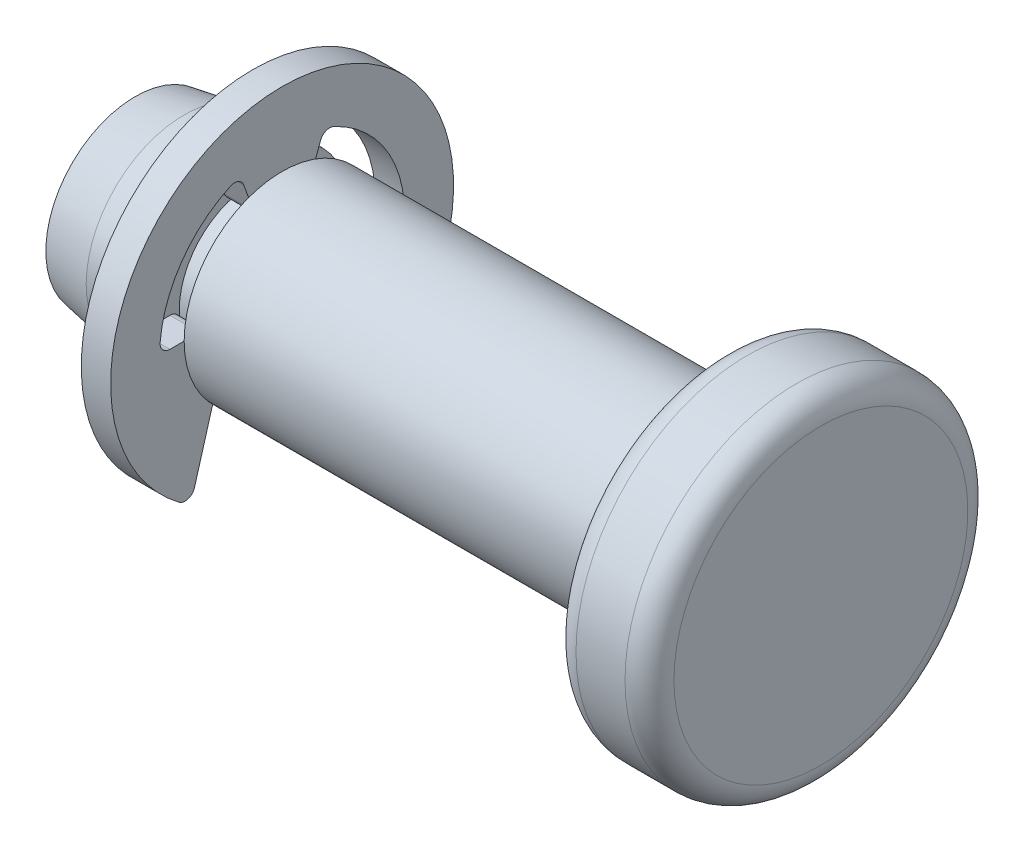
ISO-10303-21;
HEADER;
FILE_DESCRIPTION(('STEP AP214'),'2;1');
FILE_NAME('part.step','',(''),(''),'','','');
FILE_SCHEMA(('AUTOMOTIVE_DESIGN { 1 0 10303 214 1 1 1 1 }'));
ENDSEC;
DATA;
#1=APPLICATION_CONTEXT('core data for automotive mechanical design processes');
#2=APPLICATION_PROTOCOL_DEFINITION('international standard','automotive_design',2000,#1);
#3=PRODUCT_CONTEXT('',#1,'mechanical');
#4=PRODUCT('Part','Part','',(#3));
#5=PRODUCT_RELATED_PRODUCT_CATEGORY('part','',(#4));
#6=PRODUCT_DEFINITION_FORMATION('','',#4);
#7=PRODUCT_DEFINITION_CONTEXT('part definition',#1,'design');
#8=PRODUCT_DEFINITION('design','',#6,#7);
#9=PRODUCT_DEFINITION_SHAPE('','',#8);
#10=(LENGTH_UNIT() NAMED_UNIT(*) SI_UNIT(.MILLI.,.METRE.));
#11=(NAMED_UNIT(*) PLANE_ANGLE_UNIT() SI_UNIT($,.RADIAN.));
#12=(NAMED_UNIT(*) SI_UNIT($,.STERADIAN.) SOLID_ANGLE_UNIT());
#13=UNCERTAINTY_MEASURE_WITH_UNIT(LENGTH_MEASURE(1.E-05),#10,'distance_accuracy_value','');
#14=(GEOMETRIC_REPRESENTATION_CONTEXT(3) GLOBAL_UNCERTAINTY_ASSIGNED_CONTEXT((#13)) GLOBAL_UNIT_ASSIGNED_CONTEXT((#10,
#11,#12)) REPRESENTATION_CONTEXT('',''));
#15=CARTESIAN_POINT('',(0.,0.,0.));
#16=DIRECTION('',(0.,0.,1.));
#17=DIRECTION('',(1.,0.,0.));
#18=AXIS2_PLACEMENT_3D('',#15,#16,#17);
#19=CARTESIAN_POINT('',(-11.6,0.,0.));
#20=DIRECTION('',(1.,0.,0.));
#21=DIRECTION('',(0.,0.,-1.));
#22=AXIS2_PLACEMENT_3D('',#19,#20,#21);
#23=CYLINDRICAL_SURFACE('',#22,1.5);
#24=CARTESIAN_POINT('',(-11.6,0.,0.));
#25=DIRECTION('',(1.,0.,0.));
#26=DIRECTION('',(0.,0.,1.));
#27=AXIS2_PLACEMENT_3D('',#24,#25,#26);
#28=CIRCLE('',#27,1.5);
#29=CARTESIAN_POINT('',(-11.6,-0.758166141891704,-1.29428903313327));
#30=VERTEX_POINT('',#29);
#31=CARTESIAN_POINT('',(-11.6,-0.176470588235294,-1.48958320730595));
#32=VERTEX_POINT('',#31);
#33=EDGE_CURVE('E227',#30,#32,#28,.T.);
#34=ORIENTED_EDGE('',*,*,#33,.F.);
#35=DIRECTION('',(1.,0.,0.));
#36=VECTOR('',#35,1.);
#37=CARTESIAN_POINT('',(-11.6,-0.758166141891704,-1.29428903313327));
#38=LINE('',#37,#36);
#39=CARTESIAN_POINT('',(-11.,-0.758166141891704,-1.29428903313327));
#40=VERTEX_POINT('',#39);
#41=EDGE_CURVE('E212',#30,#40,#38,.T.);
#42=ORIENTED_EDGE('',*,*,#41,.T.);
#43=CARTESIAN_POINT('',(-11.,0.,0.));
#44=DIRECTION('',(1.,0.,0.));
#45=DIRECTION('',(0.,0.,1.));
#46=AXIS2_PLACEMENT_3D('',#43,#44,#45);
#47=CIRCLE('',#46,1.5);
#48=CARTESIAN_POINT('',(-11.,-0.176470588235294,-1.48958320730595));
#49=VERTEX_POINT('',#48);
#50=EDGE_CURVE('E224',#40,#49,#47,.T.);
#51=ORIENTED_EDGE('',*,*,#50,.T.);
#52=DIRECTION('',(1.,0.,0.));
#53=VECTOR('',#52,1.);
#54=CARTESIAN_POINT('',(-11.6,-0.176470588235294,-1.48958320730595));
#55=LINE('',#54,#53);
#56=EDGE_CURVE('E229',#49,#32,#55,.F.);
#57=ORIENTED_EDGE('',*,*,#56,.T.);
#58=EDGE_LOOP('',(#34,#42,#51,#57));
#59=FACE_BOUND('',#58,.T.);
#60=ADVANCED_FACE('F46',(#59),#23,.F.);
#61=CARTESIAN_POINT('',(-11.6,0.,-1.5));
#62=DIRECTION('',(0.,-1.,0.));
#63=DIRECTION('',(0.,0.,-1.));
#64=AXIS2_PLACEMENT_3D('',#61,#62,#63);
#65=PLANE('',#64);
#66=DIRECTION('',(0.,0.,-1.));
#67=VECTOR('',#66,1.);
#68=CARTESIAN_POINT('',(-11.,0.,-1.5));
#69=LINE('',#68,#67);
#70=CARTESIAN_POINT('',(-11.,0.,-1.68819430161341));
#71=VERTEX_POINT('',#70);
#72=CARTESIAN_POINT('',(-11.,0.,-2.29128784747792));
#73=VERTEX_POINT('',#72);
#74=EDGE_CURVE('E234',#71,#73,#69,.T.);
#75=ORIENTED_EDGE('',*,*,#74,.T.);
#76=DIRECTION('',(-1.,0.,0.));
#77=VECTOR('',#76,1.);
#78=CARTESIAN_POINT('',(-11.6,0.,-2.29128784747792));
#79=LINE('',#78,#77);
#80=CARTESIAN_POINT('',(-11.6,0.,-2.29128784747792));
#81=VERTEX_POINT('',#80);
#82=EDGE_CURVE('E347',#73,#81,#79,.T.);
#83=ORIENTED_EDGE('',*,*,#82,.T.);
#84=DIRECTION('',(0.,0.,-1.));
#85=VECTOR('',#84,1.);
#86=CARTESIAN_POINT('',(-11.6,0.,-1.5));
#87=LINE('',#86,#85);
#88=CARTESIAN_POINT('',(-11.6,0.,-1.68819430161341));
#89=VERTEX_POINT('',#88);
#90=EDGE_CURVE('E377',#89,#81,#87,.T.);
#91=ORIENTED_EDGE('',*,*,#90,.F.);
#92=DIRECTION('',(1.,0.,0.));
#93=VECTOR('',#92,1.);
#94=CARTESIAN_POINT('',(-11.6,0.,-1.68819430161341));
#95=LINE('',#94,#93);
#96=EDGE_CURVE('E344',#89,#71,#95,.T.);
#97=ORIENTED_EDGE('',*,*,#96,.T.);
#98=EDGE_LOOP('',(#75,#83,#91,#97));
#99=FACE_BOUND('',#98,.T.);
#100=ADVANCED_FACE('F365',(#99),#65,.F.);
#101=CARTESIAN_POINT('',(-11.6,0.,0.));
#102=DIRECTION('',(1.,0.,0.));
#103=DIRECTION('',(0.,0.,-1.));
#104=AXIS2_PLACEMENT_3D('',#101,#102,#103);
#105=CYLINDRICAL_SURFACE('',#104,2.5);
#106=CARTESIAN_POINT('',(-11.,0.,0.));
#107=DIRECTION('',(1.,0.,0.));
#108=DIRECTION('',(0.,0.,-1.));
#109=AXIS2_PLACEMENT_3D('',#106,#107,#108);
#110=CIRCLE('',#109,2.5);
#111=CARTESIAN_POINT('',(-11.,0.217391304347826,-2.49053026899774));
#112=VERTEX_POINT('',#111);
#113=CARTESIAN_POINT('',(-11.,2.26598071055033,-1.05609252407819));
#114=VERTEX_POINT('',#113);
#115=EDGE_CURVE('E237',#112,#114,#110,.T.);
#116=ORIENTED_EDGE('',*,*,#115,.T.);
#117=DIRECTION('',(1.,0.,0.));
#118=VECTOR('',#117,1.);
#119=CARTESIAN_POINT('',(-11.6,2.26598071055033,-1.05609252407819));
#120=LINE('',#119,#118);
#121=CARTESIAN_POINT('',(-11.6,2.26598071055033,-1.05609252407819));
#122=VERTEX_POINT('',#121);
#123=EDGE_CURVE('E342',#114,#122,#120,.F.);
#124=ORIENTED_EDGE('',*,*,#123,.T.);
#125=CARTESIAN_POINT('',(-11.6,0.,0.));
#126=DIRECTION('',(1.,0.,0.));
#127=DIRECTION('',(0.,0.,-1.));
#128=AXIS2_PLACEMENT_3D('',#125,#126,#127);
#129=CIRCLE('',#128,2.5);
#130=CARTESIAN_POINT('',(-11.6,0.217391304347826,-2.49053026899774));
#131=VERTEX_POINT('',#130);
#132=EDGE_CURVE('E375',#131,#122,#129,.T.);
#133=ORIENTED_EDGE('',*,*,#132,.F.);
#134=DIRECTION('',(1.,0.,0.));
#135=VECTOR('',#134,1.);
#136=CARTESIAN_POINT('',(-11.6,0.217391304347826,-2.49053026899774));
#137=LINE('',#136,#135);
#138=EDGE_CURVE('E339',#131,#112,#137,.T.);
#139=ORIENTED_EDGE('',*,*,#138,.T.);
#140=EDGE_LOOP('',(#116,#124,#133,#139));
#141=FACE_BOUND('',#140,.T.);
#142=ADVANCED_FACE('F379',(#141),#105,.F.);
#143=CARTESIAN_POINT('',(-11.6,1.40953893117887,-0.513030214988495));
#144=DIRECTION('',(0.,0.342020143325663,0.93969262078591));
#145=DIRECTION('',(0.,-0.939692620785911,0.342020143325663));
#146=AXIS2_PLACEMENT_3D('',#143,#144,#145);
#147=PLANE('',#146);
#148=DIRECTION('',(0.,-0.93969262078591,0.342020143325663));
#149=VECTOR('',#148,1.);
#150=CARTESIAN_POINT('',(-11.,1.40953893117887,-0.513030214988495));
#151=LINE('',#150,#149);
#152=CARTESIAN_POINT('',(-11.,2.15310628237143,-0.783666597994748));
#153=VERTEX_POINT('',#152);
#154=CARTESIAN_POINT('',(-11.,1.58638372767895,-0.577396456999388));
#155=VERTEX_POINT('',#154);
#156=EDGE_CURVE('E245',#153,#155,#151,.T.);
#157=ORIENTED_EDGE('',*,*,#156,.T.);
#158=DIRECTION('',(1.,0.,0.));
#159=VECTOR('',#158,1.);
#160=CARTESIAN_POINT('',(-11.6,1.58638372767895,-0.577396456999388));
#161=LINE('',#160,#159);
#162=CARTESIAN_POINT('',(-11.6,1.58638372767895,-0.577396456999388));
#163=VERTEX_POINT('',#162);
#164=EDGE_CURVE('E337',#155,#163,#161,.F.);
#165=ORIENTED_EDGE('',*,*,#164,.T.);
#166=DIRECTION('',(0.,-0.93969262078591,0.342020143325663));
#167=VECTOR('',#166,1.);
#168=CARTESIAN_POINT('',(-11.6,1.40953893117887,-0.513030214988495));
#169=LINE('',#168,#167);
#170=CARTESIAN_POINT('',(-11.6,2.15310628237143,-0.783666597994748));
#171=VERTEX_POINT('',#170);
#172=EDGE_CURVE('E381',#171,#163,#169,.T.);
#173=ORIENTED_EDGE('',*,*,#172,.F.);
#174=DIRECTION('',(-1.,0.,0.));
#175=VECTOR('',#174,1.);
#176=CARTESIAN_POINT('',(-11.,2.15310628237143,-0.783666597994749));
#177=LINE('',#176,#175);
#178=EDGE_CURVE('E334',#171,#153,#177,.F.);
#179=ORIENTED_EDGE('',*,*,#178,.T.);
#180=EDGE_LOOP('',(#157,#165,#173,#179));
#181=FACE_BOUND('',#180,.T.);
#182=ADVANCED_FACE('F473',(#181),#147,.F.);
#183=CARTESIAN_POINT('',(-11.6,0.,0.));
#184=DIRECTION('',(1.,0.,0.));
#185=DIRECTION('',(0.,0.,-1.));
#186=AXIS2_PLACEMENT_3D('',#183,#184,#185);
#187=CYLINDRICAL_SURFACE('',#186,1.5);
#188=CARTESIAN_POINT('',(-11.,0.,0.));
#189=DIRECTION('',(1.,0.,0.));
#190=DIRECTION('',(0.,0.,1.));
#191=AXIS2_PLACEMENT_3D('',#188,#189,#190);
#192=CIRCLE('',#191,1.5);
#193=CARTESIAN_POINT('',(-11.,1.46010684383301,-0.343639352507828));
#194=VERTEX_POINT('',#193);
#195=CARTESIAN_POINT('',(-11.,1.46010684383301,0.343639352507828));
#196=VERTEX_POINT('',#195);
#197=EDGE_CURVE('E248',#194,#196,#192,.T.);
#198=ORIENTED_EDGE('',*,*,#197,.T.);
#199=DIRECTION('',(1.,0.,0.));
#200=VECTOR('',#199,1.);
#201=CARTESIAN_POINT('',(-11.6,1.46010684383301,0.343639352507829));
#202=LINE('',#201,#200);
#203=CARTESIAN_POINT('',(-11.6,1.46010684383301,0.343639352507828));
#204=VERTEX_POINT('',#203);
#205=EDGE_CURVE('E332',#196,#204,#202,.F.);
#206=ORIENTED_EDGE('',*,*,#205,.T.);
#207=CARTESIAN_POINT('',(-11.6,0.,0.));
#208=DIRECTION('',(1.,0.,0.));
#209=DIRECTION('',(0.,0.,1.));
#210=AXIS2_PLACEMENT_3D('',#207,#208,#209);
#211=CIRCLE('',#210,1.5);
#212=CARTESIAN_POINT('',(-11.6,1.46010684383301,-0.343639352507828));
#213=VERTEX_POINT('',#212);
#214=EDGE_CURVE('E384',#213,#204,#211,.T.);
#215=ORIENTED_EDGE('',*,*,#214,.F.);
#216=DIRECTION('',(1.,0.,0.));
#217=VECTOR('',#216,1.);
#218=CARTESIAN_POINT('',(-11.6,1.46010684383301,-0.343639352507828));
#219=LINE('',#218,#217);
#220=EDGE_CURVE('E329',#213,#194,#219,.T.);
#221=ORIENTED_EDGE('',*,*,#220,.T.);
#222=EDGE_LOOP('',(#198,#206,#215,#221));
#223=FACE_BOUND('',#222,.T.);
#224=ADVANCED_FACE('F464',(#223),#187,.F.);
#225=CARTESIAN_POINT('',(-11.6,1.40953893117887,0.513030214988495));
#226=DIRECTION('',(0.,0.342020143325663,-0.93969262078591));
#227=DIRECTION('',(0.,0.939692620785911,0.342020143325663));
#228=AXIS2_PLACEMENT_3D('',#225,#226,#227);
#229=PLANE('',#228);
#230=DIRECTION('',(0.,0.939692620785911,0.342020143325663));
#231=VECTOR('',#230,1.);
#232=CARTESIAN_POINT('',(-11.,1.40953893117887,0.513030214988495));
#233=LINE('',#232,#231);
#234=CARTESIAN_POINT('',(-11.,1.58638372767895,0.577396456999388));
#235=VERTEX_POINT('',#234);
#236=CARTESIAN_POINT('',(-11.,2.15310628237143,0.783666597994749));
#237=VERTEX_POINT('',#236);
#238=EDGE_CURVE('E251',#235,#237,#233,.T.);
#239=ORIENTED_EDGE('',*,*,#238,.T.);
#240=DIRECTION('',(-1.,0.,0.));
#241=VECTOR('',#240,1.);
#242=CARTESIAN_POINT('',(-11.6,2.15310628237143,0.783666597994749));
#243=LINE('',#242,#241);
#244=CARTESIAN_POINT('',(-11.6,2.15310628237143,0.783666597994749));
#245=VERTEX_POINT('',#244);
#246=EDGE_CURVE('E327',#237,#245,#243,.T.);
#247=ORIENTED_EDGE('',*,*,#246,.T.);
#248=DIRECTION('',(0.,0.939692620785911,0.342020143325663));
#249=VECTOR('',#248,1.);
#250=CARTESIAN_POINT('',(-11.6,1.40953893117887,0.513030214988495));
#251=LINE('',#250,#249);
#252=CARTESIAN_POINT('',(-11.6,1.58638372767895,0.577396456999388));
#253=VERTEX_POINT('',#252);
#254=EDGE_CURVE('E391',#253,#245,#251,.T.);
#255=ORIENTED_EDGE('',*,*,#254,.F.);
#256=DIRECTION('',(1.,0.,0.));
#257=VECTOR('',#256,1.);
#258=CARTESIAN_POINT('',(-11.6,1.58638372767895,0.577396456999388));
#259=LINE('',#258,#257);
#260=EDGE_CURVE('E324',#253,#235,#259,.T.);
#261=ORIENTED_EDGE('',*,*,#260,.T.);
#262=EDGE_LOOP('',(#239,#247,#255,#261));
#263=FACE_BOUND('',#262,.T.);
#264=ADVANCED_FACE('F455',(#263),#229,.F.);
#265=CARTESIAN_POINT('',(-11.6,0.,0.));
#266=DIRECTION('',(1.,0.,0.));
#267=DIRECTION('',(0.,0.,-1.));
#268=AXIS2_PLACEMENT_3D('',#265,#266,#267);
#269=CYLINDRICAL_SURFACE('',#268,2.5);
#270=CARTESIAN_POINT('',(-11.,0.,0.));
#271=DIRECTION('',(1.,0.,0.));
#272=DIRECTION('',(0.,0.,1.));
#273=AXIS2_PLACEMENT_3D('',#270,#271,#272);
#274=CIRCLE('',#273,2.5);
#275=CARTESIAN_POINT('',(-11.,2.26598071055033,1.05609252407819));
#276=VERTEX_POINT('',#275);
#277=CARTESIAN_POINT('',(-11.,0.217391304347827,2.49053026899774));
#278=VERTEX_POINT('',#277);
#279=EDGE_CURVE('E254',#276,#278,#274,.T.);
#280=ORIENTED_EDGE('',*,*,#279,.T.);
#281=DIRECTION('',(1.,0.,0.));
#282=VECTOR('',#281,1.);
#283=CARTESIAN_POINT('',(-11.6,0.217391304347827,2.49053026899774));
#284=LINE('',#283,#282);
#285=CARTESIAN_POINT('',(-11.6,0.217391304347827,2.49053026899774));
#286=VERTEX_POINT('',#285);
#287=EDGE_CURVE('E322',#278,#286,#284,.F.);
#288=ORIENTED_EDGE('',*,*,#287,.T.);
#289=CARTESIAN_POINT('',(-11.6,0.,0.));
#290=DIRECTION('',(1.,0.,0.));
#291=DIRECTION('',(0.,0.,1.));
#292=AXIS2_PLACEMENT_3D('',#289,#290,#291);
#293=CIRCLE('',#292,2.5);
#294=CARTESIAN_POINT('',(-11.6,2.26598071055033,1.05609252407819));
#295=VERTEX_POINT('',#294);
#296=EDGE_CURVE('E394',#295,#286,#293,.T.);
#297=ORIENTED_EDGE('',*,*,#296,.F.);
#298=DIRECTION('',(1.,0.,0.));
#299=VECTOR('',#298,1.);
#300=CARTESIAN_POINT('',(-11.6,2.26598071055033,1.05609252407819));
#301=LINE('',#300,#299);
#302=EDGE_CURVE('E319',#295,#276,#301,.T.);
#303=ORIENTED_EDGE('',*,*,#302,.T.);
#304=EDGE_LOOP('',(#280,#288,#297,#303));
#305=FACE_BOUND('',#304,.T.);
#306=ADVANCED_FACE('F446',(#305),#269,.F.);
#307=CARTESIAN_POINT('',(-11.6,0.,1.5));
#308=DIRECTION('',(0.,-1.,0.));
#309=DIRECTION('',(0.,0.,-1.));
#310=AXIS2_PLACEMENT_3D('',#307,#308,#309);
#311=PLANE('',#310);
#312=DIRECTION('',(0.,0.,-1.));
#313=VECTOR('',#312,1.);
#314=CARTESIAN_POINT('',(-11.,0.,1.5));
#315=LINE('',#314,#313);
#316=CARTESIAN_POINT('',(-11.,0.,2.29128784747792));
#317=VERTEX_POINT('',#316);
#318=CARTESIAN_POINT('',(-11.,0.,1.68819430161341));
#319=VERTEX_POINT('',#318);
#320=EDGE_CURVE('E257',#317,#319,#315,.T.);
#321=ORIENTED_EDGE('',*,*,#320,.T.);
#322=DIRECTION('',(1.,0.,0.));
#323=VECTOR('',#322,1.);
#324=CARTESIAN_POINT('',(-11.6,0.,1.68819430161341));
#325=LINE('',#324,#323);
#326=CARTESIAN_POINT('',(-11.6,0.,1.68819430161341));
#327=VERTEX_POINT('',#326);
#328=EDGE_CURVE('E317',#319,#327,#325,.F.);
#329=ORIENTED_EDGE('',*,*,#328,.T.);
#330=DIRECTION('',(0.,0.,-1.));
#331=VECTOR('',#330,1.);
#332=CARTESIAN_POINT('',(-11.6,0.,1.5));
#333=LINE('',#332,#331);
#334=CARTESIAN_POINT('',(-11.6,0.,2.29128784747792));
#335=VERTEX_POINT('',#334);
#336=EDGE_CURVE('E397',#335,#327,#333,.T.);
#337=ORIENTED_EDGE('',*,*,#336,.F.);
#338=DIRECTION('',(-1.,0.,0.));
#339=VECTOR('',#338,1.);
#340=CARTESIAN_POINT('',(-11.,0.,2.29128784747792));
#341=LINE('',#340,#339);
#342=EDGE_CURVE('E314',#335,#317,#341,.F.);
#343=ORIENTED_EDGE('',*,*,#342,.T.);
#344=EDGE_LOOP('',(#321,#329,#337,#343));
#345=FACE_BOUND('',#344,.T.);
#346=ADVANCED_FACE('F437',(#345),#311,.F.);
#347=CARTESIAN_POINT('',(-11.6,0.,0.));
#348=DIRECTION('',(1.,0.,0.));
#349=DIRECTION('',(0.,0.,-1.));
#350=AXIS2_PLACEMENT_3D('',#347,#348,#349);
#351=CYLINDRICAL_SURFACE('',#350,1.5);
#352=CARTESIAN_POINT('',(-11.,0.,0.));
#353=DIRECTION('',(1.,0.,0.));
#354=DIRECTION('',(0.,0.,1.));
#355=AXIS2_PLACEMENT_3D('',#352,#353,#354);
#356=CIRCLE('',#355,1.5);
#357=CARTESIAN_POINT('',(-11.,-0.176470588235294,1.48958320730595));
#358=VERTEX_POINT('',#357);
#359=CARTESIAN_POINT('',(-11.,-0.758166141891703,1.29428903313327));
#360=VERTEX_POINT('',#359);
#361=EDGE_CURVE('E260',#358,#360,#356,.T.);
#362=ORIENTED_EDGE('',*,*,#361,.T.);
#363=DIRECTION('',(1.,0.,0.));
#364=VECTOR('',#363,1.);
#365=CARTESIAN_POINT('',(-11.6,-0.758166141891704,1.29428903313327));
#366=LINE('',#365,#364);
#367=CARTESIAN_POINT('',(-11.6,-0.758166141891703,1.29428903313327));
#368=VERTEX_POINT('',#367);
#369=EDGE_CURVE('E312',#360,#368,#366,.F.);
#370=ORIENTED_EDGE('',*,*,#369,.T.);
#371=CARTESIAN_POINT('',(-11.6,0.,0.));
#372=DIRECTION('',(1.,0.,0.));
#373=DIRECTION('',(0.,0.,1.));
#374=AXIS2_PLACEMENT_3D('',#371,#372,#373);
#375=CIRCLE('',#374,1.5);
#376=CARTESIAN_POINT('',(-11.6,-0.176470588235294,1.48958320730595));
#377=VERTEX_POINT('',#376);
#378=EDGE_CURVE('E400',#377,#368,#375,.T.);
#379=ORIENTED_EDGE('',*,*,#378,.F.);
#380=DIRECTION('',(1.,0.,0.));
#381=VECTOR('',#380,1.);
#382=CARTESIAN_POINT('',(-11.6,-0.176470588235294,1.48958320730595));
#383=LINE('',#382,#381);
#384=EDGE_CURVE('E309',#377,#358,#383,.T.);
#385=ORIENTED_EDGE('',*,*,#384,.T.);
#386=EDGE_LOOP('',(#362,#370,#379,#385));
#387=FACE_BOUND('',#386,.T.);
#388=ADVANCED_FACE('F428',(#387),#351,.F.);
#389=CARTESIAN_POINT('',(-11.6,-0.82915619758885,1.25));
#390=DIRECTION('',(0.,0.277407508573723,0.960752347999691));
#391=DIRECTION('',(0.,-0.960752347999691,0.277407508573723));
#392=AXIS2_PLACEMENT_3D('',#389,#390,#391);
#393=PLANE('',#392);
#394=DIRECTION('',(0.,-0.960752347999691,0.277407508573723));
#395=VECTOR('',#394,1.);
#396=CARTESIAN_POINT('',(-11.6,-0.82915619758885,1.25));
#397=LINE('',#396,#395);
#398=CARTESIAN_POINT('',(-11.6,-0.914736462525342,1.27471043461777));
#399=VERTEX_POINT('',#398);
#400=CARTESIAN_POINT('',(-11.6,-2.69484448927979,1.78869859579392));
#401=VERTEX_POINT('',#400);
#402=EDGE_CURVE('E403',#399,#401,#397,.T.);
#403=ORIENTED_EDGE('',*,*,#402,.F.);
#404=DIRECTION('',(1.,0.,0.));
#405=VECTOR('',#404,1.);
#406=CARTESIAN_POINT('',(-11.6,-0.914736462525342,1.27471043461777));
#407=LINE('',#406,#405);
#408=CARTESIAN_POINT('',(-11.,-0.914736462525342,1.27471043461777));
#409=VERTEX_POINT('',#408);
#410=EDGE_CURVE('E306',#399,#409,#407,.T.);
#411=ORIENTED_EDGE('',*,*,#410,.T.);
#412=DIRECTION('',(0.,-0.960752347999691,0.277407508573723));
#413=VECTOR('',#412,1.);
#414=CARTESIAN_POINT('',(-11.,-0.82915619758885,1.25));
#415=LINE('',#414,#413);
#416=CARTESIAN_POINT('',(-11.,-2.69484448927979,1.78869859579392));
#417=VERTEX_POINT('',#416);
#418=EDGE_CURVE('E263',#409,#417,#415,.T.);
#419=ORIENTED_EDGE('',*,*,#418,.T.);
#420=DIRECTION('',(1.,0.,0.));
#421=VECTOR('',#420,1.);
#422=CARTESIAN_POINT('',(-11.6,-2.69484448927979,1.78869859579392));
#423=LINE('',#422,#421);
#424=EDGE_CURVE('E304',#417,#401,#423,.F.);
#425=ORIENTED_EDGE('',*,*,#424,.T.);
#426=EDGE_LOOP('',(#403,#411,#419,#425));
#427=FACE_BOUND('',#426,.T.);
#428=ADVANCED_FACE('F420',(#427),#393,.F.);
#429=CARTESIAN_POINT('',(-11.6,0.,0.));
#430=DIRECTION('',(1.,0.,0.));
#431=DIRECTION('',(0.,0.,-1.));
#432=AXIS2_PLACEMENT_3D('',#429,#430,#431);
#433=CYLINDRICAL_SURFACE('',#432,3.5);
#434=CARTESIAN_POINT('',(-11.,0.,0.));
#435=DIRECTION('',(-1.,0.,0.));
#436=DIRECTION('',(0.,0.,1.));
#437=AXIS2_PLACEMENT_3D('',#434,#435,#436);
#438=CIRCLE('',#437,3.5);
#439=CARTESIAN_POINT('',(-11.,-2.7993243807508,2.10090052390258));
#440=VERTEX_POINT('',#439);
#441=CARTESIAN_POINT('',(-11.,-2.7993243807508,-2.10090052390258));
#442=VERTEX_POINT('',#441);
#443=EDGE_CURVE('E266',#440,#442,#438,.T.);
#444=ORIENTED_EDGE('',*,*,#443,.T.);
#445=DIRECTION('',(1.,0.,0.));
#446=VECTOR('',#445,1.);
#447=CARTESIAN_POINT('',(-11.6,-2.7993243807508,-2.10090052390258));
#448=LINE('',#447,#446);
#449=CARTESIAN_POINT('',(-11.6,-2.7993243807508,-2.10090052390258));
#450=VERTEX_POINT('',#449);
#451=EDGE_CURVE('E61',#442,#450,#448,.F.);
#452=ORIENTED_EDGE('',*,*,#451,.T.);
#453=CARTESIAN_POINT('',(-11.6,0.,0.));
#454=DIRECTION('',(-1.,0.,0.));
#455=DIRECTION('',(0.,0.,1.));
#456=AXIS2_PLACEMENT_3D('',#453,#454,#455);
#457=CIRCLE('',#456,3.5);
#458=CARTESIAN_POINT('',(-11.6,-2.7993243807508,2.10090052390258));
#459=VERTEX_POINT('',#458);
#460=EDGE_CURVE('E404',#459,#450,#457,.T.);
#461=ORIENTED_EDGE('',*,*,#460,.F.);
#462=DIRECTION('',(1.,0.,0.));
#463=VECTOR('',#462,1.);
#464=CARTESIAN_POINT('',(-11.6,-2.7993243807508,2.10090052390258));
#465=LINE('',#464,#463);
#466=EDGE_CURVE('E300',#459,#440,#465,.T.);
#467=ORIENTED_EDGE('',*,*,#466,.T.);
#468=EDGE_LOOP('',(#444,#452,#461,#467));
#469=FACE_BOUND('',#468,.T.);
#470=ADVANCED_FACE('F413',(#469),#433,.T.);
#471=CARTESIAN_POINT('',(-11.6,-0.829156197588851,-1.25));
#472=DIRECTION('',(0.,0.277407508573723,-0.960752347999691));
#473=DIRECTION('',(0.,0.960752347999691,0.277407508573723));
#474=AXIS2_PLACEMENT_3D('',#471,#472,#473);
#475=PLANE('',#474);
#476=DIRECTION('',(0.,0.960752347999691,0.277407508573723));
#477=VECTOR('',#476,1.);
#478=CARTESIAN_POINT('',(-11.,-0.829156197588851,-1.25));
#479=LINE('',#478,#477);
#480=CARTESIAN_POINT('',(-11.,-2.69484448927979,-1.78869859579392));
#481=VERTEX_POINT('',#480);
#482=CARTESIAN_POINT('',(-11.,-0.914736462525342,-1.27471043461777));
#483=VERTEX_POINT('',#482);
#484=EDGE_CURVE('E268',#481,#483,#479,.T.);
#485=ORIENTED_EDGE('',*,*,#484,.T.);
#486=DIRECTION('',(1.,0.,0.));
#487=VECTOR('',#486,1.);
#488=CARTESIAN_POINT('',(-11.6,-0.914736462525342,-1.27471043461777));
#489=LINE('',#488,#487);
#490=CARTESIAN_POINT('',(-11.6,-0.914736462525342,-1.27471043461777));
#491=VERTEX_POINT('',#490);
#492=EDGE_CURVE('E213',#483,#491,#489,.F.);
#493=ORIENTED_EDGE('',*,*,#492,.T.);
#494=DIRECTION('',(0.,0.960752347999691,0.277407508573723));
#495=VECTOR('',#494,1.);
#496=CARTESIAN_POINT('',(-11.6,-0.829156197588851,-1.25));
#497=LINE('',#496,#495);
#498=CARTESIAN_POINT('',(-11.6,-2.69484448927979,-1.78869859579392));
#499=VERTEX_POINT('',#498);
#500=EDGE_CURVE('E240',#499,#491,#497,.T.);
#501=ORIENTED_EDGE('',*,*,#500,.F.);
#502=DIRECTION('',(1.,0.,0.));
#503=VECTOR('',#502,1.);
#504=CARTESIAN_POINT('',(-11.6,-2.69484448927979,-1.78869859579392));
#505=LINE('',#504,#503);
#506=EDGE_CURVE('E218',#499,#481,#505,.T.);
#507=ORIENTED_EDGE('',*,*,#506,.T.);
#508=EDGE_LOOP('',(#485,#493,#501,#507));
#509=FACE_BOUND('',#508,.T.);
#510=ADVANCED_FACE('F409',(#509),#475,.F.);
#511=CARTESIAN_POINT('',(-11.6,0.,0.));
#512=DIRECTION('',(-1.,0.,0.));
#513=DIRECTION('',(0.,0.,1.));
#514=AXIS2_PLACEMENT_3D('',#511,#512,#513);
#515=PLANE('',#514);
#516=ORIENTED_EDGE('',*,*,#500,.T.);
#517=CARTESIAN_POINT('',(-11.6,-0.859254960810598,-1.4668609042177));
#518=DIRECTION('',(-1.,0.,0.));
#519=DIRECTION('',(0.,0.,1.));
#520=AXIS2_PLACEMENT_3D('',#517,#518,#519);
#521=CIRCLE('',#520,0.2);
#522=EDGE_CURVE('E298',#491,#30,#521,.T.);
#523=ORIENTED_EDGE('',*,*,#522,.T.);
#524=ORIENTED_EDGE('',*,*,#33,.T.);
#525=CARTESIAN_POINT('',(-11.6,-0.2,-1.68819430161341));
#526=DIRECTION('',(-1.,0.,0.));
#527=DIRECTION('',(0.,0.,1.));
#528=AXIS2_PLACEMENT_3D('',#525,#526,#527);
#529=CIRCLE('',#528,0.2);
#530=EDGE_CURVE('E286',#32,#89,#529,.T.);
#531=ORIENTED_EDGE('',*,*,#530,.T.);
#532=ORIENTED_EDGE('',*,*,#90,.T.);
#533=CARTESIAN_POINT('',(-11.6,0.2,-2.29128784747792));
#534=DIRECTION('',(-1.,0.,0.));
#535=DIRECTION('',(0.,0.,1.));
#536=AXIS2_PLACEMENT_3D('',#533,#534,#535);
#537=CIRCLE('',#536,0.2);
#538=EDGE_CURVE('E12',#81,#131,#537,.F.);
#539=ORIENTED_EDGE('',*,*,#538,.T.);
#540=ORIENTED_EDGE('',*,*,#132,.T.);
#541=CARTESIAN_POINT('',(-11.6,2.0847022537063,-0.971605122151931));
#542=DIRECTION('',(-1.,0.,0.));
#543=DIRECTION('',(0.,0.,1.));
#544=AXIS2_PLACEMENT_3D('',#541,#542,#543);
#545=CIRCLE('',#544,0.2);
#546=EDGE_CURVE('E359',#122,#171,#545,.F.);
#547=ORIENTED_EDGE('',*,*,#546,.T.);
#548=ORIENTED_EDGE('',*,*,#172,.T.);
#549=CARTESIAN_POINT('',(-11.6,1.65478775634408,-0.389457932842205));
#550=DIRECTION('',(-1.,0.,0.));
#551=DIRECTION('',(0.,0.,1.));
#552=AXIS2_PLACEMENT_3D('',#549,#550,#551);
#553=CIRCLE('',#552,0.2);
#554=EDGE_CURVE('E288',#163,#213,#553,.T.);
#555=ORIENTED_EDGE('',*,*,#554,.T.);
#556=ORIENTED_EDGE('',*,*,#214,.T.);
#557=CARTESIAN_POINT('',(-11.6,1.65478775634408,0.389457932842206));
#558=DIRECTION('',(-1.,0.,0.));
#559=DIRECTION('',(0.,0.,1.));
#560=AXIS2_PLACEMENT_3D('',#557,#558,#559);
#561=CIRCLE('',#560,0.2);
#562=EDGE_CURVE('E290',#204,#253,#561,.T.);
#563=ORIENTED_EDGE('',*,*,#562,.T.);
#564=ORIENTED_EDGE('',*,*,#254,.T.);
#565=CARTESIAN_POINT('',(-11.6,2.0847022537063,0.971605122151931));
#566=DIRECTION('',(-1.,0.,0.));
#567=DIRECTION('',(0.,0.,1.));
#568=AXIS2_PLACEMENT_3D('',#565,#566,#567);
#569=CIRCLE('',#568,0.2);
#570=EDGE_CURVE('E355',#245,#295,#569,.F.);
#571=ORIENTED_EDGE('',*,*,#570,.T.);
#572=ORIENTED_EDGE('',*,*,#296,.T.);
#573=CARTESIAN_POINT('',(-11.6,0.2,2.29128784747792));
#574=DIRECTION('',(-1.,0.,0.));
#575=DIRECTION('',(0.,0.,1.));
#576=AXIS2_PLACEMENT_3D('',#573,#574,#575);
#577=CIRCLE('',#576,0.2);
#578=EDGE_CURVE('E351',#286,#335,#577,.F.);
#579=ORIENTED_EDGE('',*,*,#578,.T.);
#580=ORIENTED_EDGE('',*,*,#336,.T.);
#581=CARTESIAN_POINT('',(-11.6,-0.2,1.68819430161341));
#582=DIRECTION('',(-1.,0.,0.));
#583=DIRECTION('',(0.,0.,1.));
#584=AXIS2_PLACEMENT_3D('',#581,#582,#583);
#585=CIRCLE('',#584,0.2);
#586=EDGE_CURVE('E292',#327,#377,#585,.T.);
#587=ORIENTED_EDGE('',*,*,#586,.T.);
#588=ORIENTED_EDGE('',*,*,#378,.T.);
#589=CARTESIAN_POINT('',(-11.6,-0.859254960810597,1.4668609042177));
#590=DIRECTION('',(-1.,0.,0.));
#591=DIRECTION('',(0.,0.,1.));
#592=AXIS2_PLACEMENT_3D('',#589,#590,#591);
#593=CIRCLE('',#592,0.2);
#594=EDGE_CURVE('E294',#368,#399,#593,.T.);
#595=ORIENTED_EDGE('',*,*,#594,.T.);
#596=ORIENTED_EDGE('',*,*,#402,.T.);
#597=CARTESIAN_POINT('',(-11.6,-2.63936298756504,1.98084906539386));
#598=DIRECTION('',(-1.,0.,0.));
#599=DIRECTION('',(0.,0.,1.));
#600=AXIS2_PLACEMENT_3D('',#597,#598,#599);
#601=CIRCLE('',#600,0.2);
#602=EDGE_CURVE('E68',#401,#459,#601,.T.);
#603=ORIENTED_EDGE('',*,*,#602,.T.);
#604=ORIENTED_EDGE('',*,*,#460,.T.);
#605=CARTESIAN_POINT('',(-11.6,-2.63936298756504,-1.98084906539386));
#606=DIRECTION('',(-1.,0.,0.));
#607=DIRECTION('',(0.,0.,1.));
#608=AXIS2_PLACEMENT_3D('',#605,#606,#607);
#609=CIRCLE('',#608,0.2);
#610=EDGE_CURVE('E296',#450,#499,#609,.T.);
#611=ORIENTED_EDGE('',*,*,#610,.T.);
#612=EDGE_LOOP('',(#516,#523,#524,#531,#532,#539,#540,#547,#548,#555,#556,#563,#564,#571,#572,
#579,#580,#587,#588,#595,#596,#603,#604,#611));
#613=FACE_BOUND('',#612,.T.);
#614=ADVANCED_FACE('F374',(#613),#515,.T.);
#615=CARTESIAN_POINT('',(-11.,0.,0.));
#616=DIRECTION('',(-1.,0.,0.));
#617=DIRECTION('',(0.,0.,1.));
#618=AXIS2_PLACEMENT_3D('',#615,#616,#617);
#619=PLANE('',#618);
#620=ORIENTED_EDGE('',*,*,#50,.F.);
#621=CARTESIAN_POINT('',(-11.,-0.859254960810598,-1.4668609042177));
#622=DIRECTION('',(-1.,0.,0.));
#623=DIRECTION('',(0.,0.,1.));
#624=AXIS2_PLACEMENT_3D('',#621,#622,#623);
#625=CIRCLE('',#624,0.2);
#626=EDGE_CURVE('E208',#40,#483,#625,.F.);
#627=ORIENTED_EDGE('',*,*,#626,.T.);
#628=ORIENTED_EDGE('',*,*,#484,.F.);
#629=CARTESIAN_POINT('',(-11.,-2.63936298756504,-1.98084906539386));
#630=DIRECTION('',(-1.,0.,0.));
#631=DIRECTION('',(0.,0.,1.));
#632=AXIS2_PLACEMENT_3D('',#629,#630,#631);
#633=CIRCLE('',#632,0.2);
#634=EDGE_CURVE('E219',#481,#442,#633,.F.);
#635=ORIENTED_EDGE('',*,*,#634,.T.);
#636=ORIENTED_EDGE('',*,*,#443,.F.);
#637=CARTESIAN_POINT('',(-11.,-2.63936298756504,1.98084906539386));
#638=DIRECTION('',(-1.,0.,0.));
#639=DIRECTION('',(0.,0.,1.));
#640=AXIS2_PLACEMENT_3D('',#637,#638,#639);
#641=CIRCLE('',#640,0.2);
#642=EDGE_CURVE('E228',#440,#417,#641,.F.);
#643=ORIENTED_EDGE('',*,*,#642,.T.);
#644=ORIENTED_EDGE('',*,*,#418,.F.);
#645=CARTESIAN_POINT('',(-11.,-0.859254960810597,1.4668609042177));
#646=DIRECTION('',(-1.,0.,0.));
#647=DIRECTION('',(0.,0.,1.));
#648=AXIS2_PLACEMENT_3D('',#645,#646,#647);
#649=CIRCLE('',#648,0.2);
#650=EDGE_CURVE('E279',#409,#360,#649,.F.);
#651=ORIENTED_EDGE('',*,*,#650,.T.);
#652=ORIENTED_EDGE('',*,*,#361,.F.);
#653=CARTESIAN_POINT('',(-11.,-0.2,1.68819430161341));
#654=DIRECTION('',(-1.,0.,0.));
#655=DIRECTION('',(0.,0.,1.));
#656=AXIS2_PLACEMENT_3D('',#653,#654,#655);
#657=CIRCLE('',#656,0.2);
#658=EDGE_CURVE('E277',#358,#319,#657,.F.);
#659=ORIENTED_EDGE('',*,*,#658,.T.);
#660=ORIENTED_EDGE('',*,*,#320,.F.);
#661=CARTESIAN_POINT('',(-11.,0.2,2.29128784747792));
#662=DIRECTION('',(-1.,0.,0.));
#663=DIRECTION('',(0.,0.,1.));
#664=AXIS2_PLACEMENT_3D('',#661,#662,#663);
#665=CIRCLE('',#664,0.2);
#666=EDGE_CURVE('E349',#317,#278,#665,.T.);
#667=ORIENTED_EDGE('',*,*,#666,.T.);
#668=ORIENTED_EDGE('',*,*,#279,.F.);
#669=CARTESIAN_POINT('',(-11.,2.0847022537063,0.971605122151931));
#670=DIRECTION('',(-1.,0.,0.));
#671=DIRECTION('',(0.,0.,1.));
#672=AXIS2_PLACEMENT_3D('',#669,#670,#671);
#673=CIRCLE('',#672,0.2);
#674=EDGE_CURVE('E353',#276,#237,#673,.T.);
#675=ORIENTED_EDGE('',*,*,#674,.T.);
#676=ORIENTED_EDGE('',*,*,#238,.F.);
#677=CARTESIAN_POINT('',(-11.,1.65478775634408,0.389457932842206));
#678=DIRECTION('',(-1.,0.,0.));
#679=DIRECTION('',(0.,0.,1.));
#680=AXIS2_PLACEMENT_3D('',#677,#678,#679);
#681=CIRCLE('',#680,0.2);
#682=EDGE_CURVE('E275',#235,#196,#681,.F.);
#683=ORIENTED_EDGE('',*,*,#682,.T.);
#684=ORIENTED_EDGE('',*,*,#197,.F.);
#685=CARTESIAN_POINT('',(-11.,1.65478775634408,-0.389457932842205));
#686=DIRECTION('',(-1.,0.,0.));
#687=DIRECTION('',(0.,0.,1.));
#688=AXIS2_PLACEMENT_3D('',#685,#686,#687);
#689=CIRCLE('',#688,0.2);
#690=EDGE_CURVE('E273',#194,#155,#689,.F.);
#691=ORIENTED_EDGE('',*,*,#690,.T.);
#692=ORIENTED_EDGE('',*,*,#156,.F.);
#693=CARTESIAN_POINT('',(-11.,2.0847022537063,-0.971605122151931));
#694=DIRECTION('',(-1.,0.,0.));
#695=DIRECTION('',(0.,0.,1.));
#696=AXIS2_PLACEMENT_3D('',#693,#694,#695);
#697=CIRCLE('',#696,0.2);
#698=EDGE_CURVE('E357',#153,#114,#697,.T.);
#699=ORIENTED_EDGE('',*,*,#698,.T.);
#700=ORIENTED_EDGE('',*,*,#115,.F.);
#701=CARTESIAN_POINT('',(-11.,0.2,-2.29128784747792));
#702=DIRECTION('',(-1.,0.,0.));
#703=DIRECTION('',(0.,0.,1.));
#704=AXIS2_PLACEMENT_3D('',#701,#702,#703);
#705=CIRCLE('',#704,0.2);
#706=EDGE_CURVE('E54',#112,#73,#705,.T.);
#707=ORIENTED_EDGE('',*,*,#706,.T.);
#708=ORIENTED_EDGE('',*,*,#74,.F.);
#709=CARTESIAN_POINT('',(-11.,-0.2,-1.68819430161341));
#710=DIRECTION('',(-1.,0.,0.));
#711=DIRECTION('',(0.,0.,1.));
#712=AXIS2_PLACEMENT_3D('',#709,#710,#711);
#713=CIRCLE('',#712,0.2);
#714=EDGE_CURVE('E233',#71,#49,#713,.F.);
#715=ORIENTED_EDGE('',*,*,#714,.T.);
#716=EDGE_LOOP('',(#620,#627,#628,#635,#636,#643,#644,#651,#652,#659,#660,#667,#668,#675,#676,
#683,#684,#691,#692,#699,#700,#707,#708,#715));
#717=FACE_BOUND('',#716,.T.);
#718=ADVANCED_FACE('F231',(#717),#619,.F.);
#719=CARTESIAN_POINT('',(-11.6,-0.859254960810598,-1.4668609042177));
#720=DIRECTION('',(1.,0.,0.));
#721=DIRECTION('',(0.,0.,-1.));
#722=AXIS2_PLACEMENT_3D('',#719,#720,#721);
#723=CYLINDRICAL_SURFACE('',#722,0.2);
#724=ORIENTED_EDGE('',*,*,#522,.F.);
#725=ORIENTED_EDGE('',*,*,#492,.F.);
#726=ORIENTED_EDGE('',*,*,#626,.F.);
#727=ORIENTED_EDGE('',*,*,#41,.F.);
#728=EDGE_LOOP('',(#724,#725,#726,#727));
#729=FACE_BOUND('',#728,.T.);
#730=ADVANCED_FACE('F211',(#729),#723,.T.);
#731=CARTESIAN_POINT('',(-11.6,-2.63936298756504,-1.98084906539386));
#732=DIRECTION('',(1.,0.,0.));
#733=DIRECTION('',(0.,0.,-1.));
#734=AXIS2_PLACEMENT_3D('',#731,#732,#733);
#735=CYLINDRICAL_SURFACE('',#734,0.2);
#736=ORIENTED_EDGE('',*,*,#610,.F.);
#737=ORIENTED_EDGE('',*,*,#451,.F.);
#738=ORIENTED_EDGE('',*,*,#634,.F.);
#739=ORIENTED_EDGE('',*,*,#506,.F.);
#740=EDGE_LOOP('',(#736,#737,#738,#739));
#741=FACE_BOUND('',#740,.T.);
#742=ADVANCED_FACE('F411',(#741),#735,.T.);
#743=CARTESIAN_POINT('',(-11.6,-0.859254960810597,1.4668609042177));
#744=DIRECTION('',(1.,0.,0.));
#745=DIRECTION('',(0.,0.,-1.));
#746=AXIS2_PLACEMENT_3D('',#743,#744,#745);
#747=CYLINDRICAL_SURFACE('',#746,0.2);
#748=ORIENTED_EDGE('',*,*,#594,.F.);
#749=ORIENTED_EDGE('',*,*,#369,.F.);
#750=ORIENTED_EDGE('',*,*,#650,.F.);
#751=ORIENTED_EDGE('',*,*,#410,.F.);
#752=EDGE_LOOP('',(#748,#749,#750,#751));
#753=FACE_BOUND('',#752,.T.);
#754=ADVANCED_FACE('F424',(#753),#747,.T.);
#755=CARTESIAN_POINT('',(-11.6,-0.2,1.68819430161341));
#756=DIRECTION('',(1.,0.,0.));
#757=DIRECTION('',(0.,0.,-1.));
#758=AXIS2_PLACEMENT_3D('',#755,#756,#757);
#759=CYLINDRICAL_SURFACE('',#758,0.2);
#760=ORIENTED_EDGE('',*,*,#586,.F.);
#761=ORIENTED_EDGE('',*,*,#328,.F.);
#762=ORIENTED_EDGE('',*,*,#658,.F.);
#763=ORIENTED_EDGE('',*,*,#384,.F.);
#764=EDGE_LOOP('',(#760,#761,#762,#763));
#765=FACE_BOUND('',#764,.T.);
#766=ADVANCED_FACE('F433',(#765),#759,.T.);
#767=CARTESIAN_POINT('',(-11.6,0.2,2.29128784747792));
#768=DIRECTION('',(1.,0.,0.));
#769=DIRECTION('',(0.,0.,-1.));
#770=AXIS2_PLACEMENT_3D('',#767,#768,#769);
#771=CYLINDRICAL_SURFACE('',#770,0.2);
#772=ORIENTED_EDGE('',*,*,#578,.F.);
#773=ORIENTED_EDGE('',*,*,#287,.F.);
#774=ORIENTED_EDGE('',*,*,#666,.F.);
#775=ORIENTED_EDGE('',*,*,#342,.F.);
#776=EDGE_LOOP('',(#772,#773,#774,#775));
#777=FACE_BOUND('',#776,.T.);
#778=ADVANCED_FACE('F442',(#777),#771,.F.);
#779=CARTESIAN_POINT('',(-11.6,2.0847022537063,0.971605122151931));
#780=DIRECTION('',(1.,0.,0.));
#781=DIRECTION('',(0.,0.,-1.));
#782=AXIS2_PLACEMENT_3D('',#779,#780,#781);
#783=CYLINDRICAL_SURFACE('',#782,0.2);
#784=ORIENTED_EDGE('',*,*,#570,.F.);
#785=ORIENTED_EDGE('',*,*,#246,.F.);
#786=ORIENTED_EDGE('',*,*,#674,.F.);
#787=ORIENTED_EDGE('',*,*,#302,.F.);
#788=EDGE_LOOP('',(#784,#785,#786,#787));
#789=FACE_BOUND('',#788,.T.);
#790=ADVANCED_FACE('F451',(#789),#783,.F.);
#791=CARTESIAN_POINT('',(-11.6,1.65478775634408,0.389457932842206));
#792=DIRECTION('',(1.,0.,0.));
#793=DIRECTION('',(0.,0.,-1.));
#794=AXIS2_PLACEMENT_3D('',#791,#792,#793);
#795=CYLINDRICAL_SURFACE('',#794,0.2);
#796=ORIENTED_EDGE('',*,*,#562,.F.);
#797=ORIENTED_EDGE('',*,*,#205,.F.);
#798=ORIENTED_EDGE('',*,*,#682,.F.);
#799=ORIENTED_EDGE('',*,*,#260,.F.);
#800=EDGE_LOOP('',(#796,#797,#798,#799));
#801=FACE_BOUND('',#800,.T.);
#802=ADVANCED_FACE('F460',(#801),#795,.T.);
#803=CARTESIAN_POINT('',(-11.6,1.65478775634408,-0.389457932842205));
#804=DIRECTION('',(1.,0.,0.));
#805=DIRECTION('',(0.,0.,-1.));
#806=AXIS2_PLACEMENT_3D('',#803,#804,#805);
#807=CYLINDRICAL_SURFACE('',#806,0.2);
#808=ORIENTED_EDGE('',*,*,#554,.F.);
#809=ORIENTED_EDGE('',*,*,#164,.F.);
#810=ORIENTED_EDGE('',*,*,#690,.F.);
#811=ORIENTED_EDGE('',*,*,#220,.F.);
#812=EDGE_LOOP('',(#808,#809,#810,#811));
#813=FACE_BOUND('',#812,.T.);
#814=ADVANCED_FACE('F469',(#813),#807,.T.);
#815=CARTESIAN_POINT('',(-11.6,2.0847022537063,-0.971605122151931));
#816=DIRECTION('',(1.,0.,0.));
#817=DIRECTION('',(0.,0.,-1.));
#818=AXIS2_PLACEMENT_3D('',#815,#816,#817);
#819=CYLINDRICAL_SURFACE('',#818,0.2);
#820=ORIENTED_EDGE('',*,*,#546,.F.);
#821=ORIENTED_EDGE('',*,*,#123,.F.);
#822=ORIENTED_EDGE('',*,*,#698,.F.);
#823=ORIENTED_EDGE('',*,*,#178,.F.);
#824=EDGE_LOOP('',(#820,#821,#822,#823));
#825=FACE_BOUND('',#824,.T.);
#826=ADVANCED_FACE('F477',(#825),#819,.F.);
#827=CARTESIAN_POINT('',(-11.6,0.2,-2.29128784747792));
#828=DIRECTION('',(1.,0.,0.));
#829=DIRECTION('',(0.,0.,-1.));
#830=AXIS2_PLACEMENT_3D('',#827,#828,#829);
#831=CYLINDRICAL_SURFACE('',#830,0.2);
#832=ORIENTED_EDGE('',*,*,#538,.F.);
#833=ORIENTED_EDGE('',*,*,#82,.F.);
#834=ORIENTED_EDGE('',*,*,#706,.F.);
#835=ORIENTED_EDGE('',*,*,#138,.F.);
#836=EDGE_LOOP('',(#832,#833,#834,#835));
#837=FACE_BOUND('',#836,.T.);
#838=ADVANCED_FACE('F370',(#837),#831,.F.);
#839=CARTESIAN_POINT('',(-11.6,-0.2,-1.68819430161341));
#840=DIRECTION('',(1.,0.,0.));
#841=DIRECTION('',(0.,0.,-1.));
#842=AXIS2_PLACEMENT_3D('',#839,#840,#841);
#843=CYLINDRICAL_SURFACE('',#842,0.2);
#844=ORIENTED_EDGE('',*,*,#530,.F.);
#845=ORIENTED_EDGE('',*,*,#56,.F.);
#846=ORIENTED_EDGE('',*,*,#714,.F.);
#847=ORIENTED_EDGE('',*,*,#96,.F.);
#848=EDGE_LOOP('',(#844,#845,#846,#847));
#849=FACE_BOUND('',#848,.T.);
#850=ADVANCED_FACE('F484',(#849),#843,.T.);
#851=CARTESIAN_POINT('',(-11.6,-2.63936298756504,1.98084906539386));
#852=DIRECTION('',(1.,0.,0.));
#853=DIRECTION('',(0.,0.,-1.));
#854=AXIS2_PLACEMENT_3D('',#851,#852,#853);
#855=CYLINDRICAL_SURFACE('',#854,0.2);
#856=ORIENTED_EDGE('',*,*,#602,.F.);
#857=ORIENTED_EDGE('',*,*,#424,.F.);
#858=ORIENTED_EDGE('',*,*,#642,.F.);
#859=ORIENTED_EDGE('',*,*,#466,.F.);
#860=EDGE_LOOP('',(#856,#857,#858,#859));
#861=FACE_BOUND('',#860,.T.);
#862=ADVANCED_FACE('F48',(#861),#855,.T.);
#863=CLOSED_SHELL('',(#60,#100,#142,#182,#224,#264,#306,#346,#388,#428,#470,#510,#614,#718,#730,
#742,#754,#766,#778,#790,#802,#814,#826,#838,#850,#862));
#864=MANIFOLD_SOLID_BREP('B2',#863);
#865=CARTESIAN_POINT('',(0.,0.,0.));
#866=DIRECTION('',(-1.,0.,0.));
#867=DIRECTION('',(0.,0.,1.));
#868=AXIS2_PLACEMENT_3D('',#865,#866,#867);
#869=PLANE('',#868);
#870=CARTESIAN_POINT('',(0.,0.,0.));
#871=DIRECTION('',(-1.,0.,0.));
#872=DIRECTION('',(0.,0.,1.));
#873=AXIS2_PLACEMENT_3D('',#870,#871,#872);
#874=CIRCLE('',#873,3.);
#875=CARTESIAN_POINT('',(0.,0.,3.));
#876=VERTEX_POINT('',#875);
#877=EDGE_CURVE('E696',#876,#876,#874,.F.);
#878=ORIENTED_EDGE('',*,*,#877,.T.);
#879=EDGE_LOOP('',(#878));
#880=FACE_BOUND('',#879,.T.);
#881=ADVANCED_FACE('F689',(#880),#869,.F.);
#882=CARTESIAN_POINT('',(-14.,0.,0.));
#883=DIRECTION('',(-1.,0.,0.));
#884=DIRECTION('',(0.,0.,1.));
#885=AXIS2_PLACEMENT_3D('',#882,#883,#884);
#886=CYLINDRICAL_SURFACE('',#885,3.5);
#887=CARTESIAN_POINT('',(-0.5,0.,0.));
#888=DIRECTION('',(-1.,0.,0.));
#889=DIRECTION('',(0.,0.,1.));
#890=AXIS2_PLACEMENT_3D('',#887,#888,#889);
#891=CIRCLE('',#890,3.5);
#892=CARTESIAN_POINT('',(-0.5,0.,3.5));
#893=VERTEX_POINT('',#892);
#894=EDGE_CURVE('E700',#893,#893,#891,.T.);
#895=ORIENTED_EDGE('',*,*,#894,.T.);
#896=EDGE_LOOP('',(#895));
#897=FACE_BOUND('',#896,.T.);
#898=CARTESIAN_POINT('',(-1.5,0.,0.));
#899=DIRECTION('',(1.,0.,0.));
#900=DIRECTION('',(0.,0.,-1.));
#901=AXIS2_PLACEMENT_3D('',#898,#899,#900);
#902=CIRCLE('',#901,3.5);
#903=CARTESIAN_POINT('',(-1.5,0.,-3.5));
#904=VERTEX_POINT('',#903);
#905=EDGE_CURVE('E704',#904,#904,#902,.T.);
#906=ORIENTED_EDGE('',*,*,#905,.T.);
#907=EDGE_LOOP('',(#906));
#908=FACE_BOUND('',#907,.T.);
#909=ADVANCED_FACE('F759',(#897,#908),#886,.T.);
#910=CARTESIAN_POINT('',(-2.,0.,-3.5));
#911=DIRECTION('',(1.,0.,0.));
#912=DIRECTION('',(0.,0.,-1.));
#913=AXIS2_PLACEMENT_3D('',#910,#911,#912);
#914=PLANE('',#913);
#915=CARTESIAN_POINT('',(-2.,0.,0.));
#916=DIRECTION('',(1.,0.,0.));
#917=DIRECTION('',(0.,0.,-1.));
#918=AXIS2_PLACEMENT_3D('',#915,#916,#917);
#919=CIRCLE('',#918,3.);
#920=CARTESIAN_POINT('',(-2.,0.,-3.));
#921=VERTEX_POINT('',#920);
#922=EDGE_CURVE('E45',#921,#921,#919,.F.);
#923=ORIENTED_EDGE('',*,*,#922,.T.);
#924=EDGE_LOOP('',(#923));
#925=FACE_BOUND('',#924,.T.);
#926=CARTESIAN_POINT('',(-2.,0.,0.));
#927=DIRECTION('',(-1.,0.,0.));
#928=DIRECTION('',(0.,0.,1.));
#929=AXIS2_PLACEMENT_3D('',#926,#927,#928);
#930=CIRCLE('',#929,2.);
#931=CARTESIAN_POINT('',(-2.,0.,2.));
#932=VERTEX_POINT('',#931);
#933=EDGE_CURVE('E715',#932,#932,#930,.T.);
#934=ORIENTED_EDGE('',*,*,#933,.F.);
#935=EDGE_LOOP('',(#934));
#936=FACE_BOUND('',#935,.T.);
#937=ADVANCED_FACE('F754',(#925,#936),#914,.F.);
#938=CARTESIAN_POINT('',(-14.,0.,0.));
#939=DIRECTION('',(-1.,0.,0.));
#940=DIRECTION('',(0.,0.,1.));
#941=AXIS2_PLACEMENT_3D('',#938,#939,#940);
#942=CYLINDRICAL_SURFACE('',#941,2.);
#943=CARTESIAN_POINT('',(-11.,0.,0.));
#944=DIRECTION('',(-1.,0.,0.));
#945=DIRECTION('',(0.,0.,1.));
#946=AXIS2_PLACEMENT_3D('',#943,#944,#945);
#947=CIRCLE('',#946,2.);
#948=CARTESIAN_POINT('',(-11.,0.,2.));
#949=VERTEX_POINT('',#948);
#950=EDGE_CURVE('E718',#949,#949,#947,.T.);
#951=ORIENTED_EDGE('',*,*,#950,.F.);
#952=EDGE_LOOP('',(#951));
#953=FACE_BOUND('',#952,.T.);
#954=ORIENTED_EDGE('',*,*,#933,.T.);
#955=EDGE_LOOP('',(#954));
#956=FACE_BOUND('',#955,.T.);
#957=ADVANCED_FACE('F748',(#953,#956),#942,.T.);
#958=CARTESIAN_POINT('',(-11.,0.,-2.));
#959=DIRECTION('',(1.,0.,0.));
#960=DIRECTION('',(0.,0.,-1.));
#961=AXIS2_PLACEMENT_3D('',#958,#959,#960);
#962=PLANE('',#961);
#963=CARTESIAN_POINT('',(-11.,0.,0.));
#964=DIRECTION('',(-1.,0.,0.));
#965=DIRECTION('',(0.,0.,1.));
#966=AXIS2_PLACEMENT_3D('',#963,#964,#965);
#967=CIRCLE('',#966,1.5);
#968=CARTESIAN_POINT('',(-11.,0.,1.5));
#969=VERTEX_POINT('',#968);
#970=EDGE_CURVE('E721',#969,#969,#967,.T.);
#971=ORIENTED_EDGE('',*,*,#970,.F.);
#972=EDGE_LOOP('',(#971));
#973=FACE_BOUND('',#972,.T.);
#974=ORIENTED_EDGE('',*,*,#950,.T.);
#975=EDGE_LOOP('',(#974));
#976=FACE_BOUND('',#975,.T.);
#977=ADVANCED_FACE('F742',(#973,#976),#962,.F.);
#978=CARTESIAN_POINT('',(-14.,0.,0.));
#979=DIRECTION('',(-1.,0.,0.));
#980=DIRECTION('',(0.,0.,1.));
#981=AXIS2_PLACEMENT_3D('',#978,#979,#980);
#982=CYLINDRICAL_SURFACE('',#981,1.5);
#983=CARTESIAN_POINT('',(-11.6,0.,0.));
#984=DIRECTION('',(-1.,0.,0.));
#985=DIRECTION('',(0.,0.,1.));
#986=AXIS2_PLACEMENT_3D('',#983,#984,#985);
#987=CIRCLE('',#986,1.5);
#988=CARTESIAN_POINT('',(-11.6,0.,1.5));
#989=VERTEX_POINT('',#988);
#990=EDGE_CURVE('E724',#989,#989,#987,.T.);
#991=ORIENTED_EDGE('',*,*,#990,.F.);
#992=EDGE_LOOP('',(#991));
#993=FACE_BOUND('',#992,.T.);
#994=ORIENTED_EDGE('',*,*,#970,.T.);
#995=EDGE_LOOP('',(#994));
#996=FACE_BOUND('',#995,.T.);
#997=ADVANCED_FACE('F736',(#993,#996),#982,.T.);
#998=CARTESIAN_POINT('',(-11.6,0.,-1.5));
#999=DIRECTION('',(-1.,0.,0.));
#1000=DIRECTION('',(0.,0.,1.));
#1001=AXIS2_PLACEMENT_3D('',#998,#999,#1000);
#1002=PLANE('',#1001);
#1003=CARTESIAN_POINT('',(-11.6,0.,0.));
#1004=DIRECTION('',(-1.,0.,0.));
#1005=DIRECTION('',(0.,0.,1.));
#1006=AXIS2_PLACEMENT_3D('',#1003,#1004,#1005);
#1007=CIRCLE('',#1006,2.);
#1008=CARTESIAN_POINT('',(-11.6,0.,2.));
#1009=VERTEX_POINT('',#1008);
#1010=EDGE_CURVE('E727',#1009,#1009,#1007,.T.);
#1011=ORIENTED_EDGE('',*,*,#1010,.F.);
#1012=EDGE_LOOP('',(#1011));
#1013=FACE_BOUND('',#1012,.T.);
#1014=ORIENTED_EDGE('',*,*,#990,.T.);
#1015=EDGE_LOOP('',(#1014));
#1016=FACE_BOUND('',#1015,.T.);
#1017=ADVANCED_FACE('F733',(#1013,#1016),#1002,.F.);
#1018=CARTESIAN_POINT('',(-14.,0.,0.));
#1019=DIRECTION('',(-1.,0.,0.));
#1020=DIRECTION('',(0.,0.,1.));
#1021=AXIS2_PLACEMENT_3D('',#1018,#1019,#1020);
#1022=CYLINDRICAL_SURFACE('',#1021,2.);
#1023=CARTESIAN_POINT('',(-12.9999999999999,0.,0.));
#1024=DIRECTION('',(1.,0.,0.));
#1025=DIRECTION('',(0.,0.,-1.));
#1026=AXIS2_PLACEMENT_3D('',#1023,#1024,#1025);
#1027=CIRCLE('',#1026,2.);
#1028=CARTESIAN_POINT('',(-12.9999999999999,0.,-2.));
#1029=VERTEX_POINT('',#1028);
#1030=EDGE_CURVE('E709',#1029,#1029,#1027,.T.);
#1031=ORIENTED_EDGE('',*,*,#1030,.T.);
#1032=EDGE_LOOP('',(#1031));
#1033=FACE_BOUND('',#1032,.T.);
#1034=ORIENTED_EDGE('',*,*,#1010,.T.);
#1035=EDGE_LOOP('',(#1034));
#1036=FACE_BOUND('',#1035,.T.);
#1037=ADVANCED_FACE('F731',(#1033,#1036),#1022,.T.);
#1038=CARTESIAN_POINT('',(-14.,0.,-2.));
#1039=DIRECTION('',(1.,0.,0.));
#1040=DIRECTION('',(0.,0.,-1.));
#1041=AXIS2_PLACEMENT_3D('',#1038,#1039,#1040);
#1042=PLANE('',#1041);
#1043=CARTESIAN_POINT('',(-14.,0.,0.));
#1044=DIRECTION('',(1.,0.,0.));
#1045=DIRECTION('',(0.,0.,-1.));
#1046=AXIS2_PLACEMENT_3D('',#1043,#1044,#1045);
#1047=CIRCLE('',#1046,1.82367301929152);
#1048=CARTESIAN_POINT('',(-14.,0.,-1.82367301929152));
#1049=VERTEX_POINT('',#1048);
#1050=EDGE_CURVE('E712',#1049,#1049,#1047,.F.);
#1051=ORIENTED_EDGE('',*,*,#1050,.T.);
#1052=EDGE_LOOP('',(#1051));
#1053=FACE_BOUND('',#1052,.T.);
#1054=ADVANCED_FACE('F777',(#1053),#1042,.F.);
#1055=CARTESIAN_POINT('',(-14.,0.,0.));
#1056=DIRECTION('',(1.,0.,0.));
#1057=DIRECTION('',(0.,0.,-1.));
#1058=AXIS2_PLACEMENT_3D('',#1055,#1056,#1057);
#1059=CONICAL_SURFACE('',#1058,1.82367301929152,0.17453292519943);
#1060=ORIENTED_EDGE('',*,*,#1030,.F.);
#1061=EDGE_LOOP('',(#1060));
#1062=FACE_BOUND('',#1061,.T.);
#1063=ORIENTED_EDGE('',*,*,#1050,.F.);
#1064=EDGE_LOOP('',(#1063));
#1065=FACE_BOUND('',#1064,.T.);
#1066=ADVANCED_FACE('F772',(#1062,#1065),#1059,.T.);
#1067=CARTESIAN_POINT('',(-0.5,0.,0.));
#1068=DIRECTION('',(-1.,0.,0.));
#1069=DIRECTION('',(0.,0.,1.));
#1070=AXIS2_PLACEMENT_3D('',#1067,#1068,#1069);
#1071=TOROIDAL_SURFACE('',#1070,3.,0.5);
#1072=ORIENTED_EDGE('',*,*,#877,.F.);
#1073=EDGE_LOOP('',(#1072));
#1074=FACE_BOUND('',#1073,.T.);
#1075=ORIENTED_EDGE('',*,*,#894,.F.);
#1076=EDGE_LOOP('',(#1075));
#1077=FACE_BOUND('',#1076,.T.);
#1078=ADVANCED_FACE('F776',(#1074,#1077),#1071,.T.);
#1079=CARTESIAN_POINT('',(-1.5,0.,0.));
#1080=DIRECTION('',(1.,0.,0.));
#1081=DIRECTION('',(0.,0.,-1.));
#1082=AXIS2_PLACEMENT_3D('',#1079,#1080,#1081);
#1083=TOROIDAL_SURFACE('',#1082,3.,0.5);
#1084=ORIENTED_EDGE('',*,*,#905,.F.);
#1085=EDGE_LOOP('',(#1084));
#1086=FACE_BOUND('',#1085,.T.);
#1087=ORIENTED_EDGE('',*,*,#922,.F.);
#1088=EDGE_LOOP('',(#1087));
#1089=FACE_BOUND('',#1088,.T.);
#1090=ADVANCED_FACE('F691',(#1086,#1089),#1083,.T.);
#1091=CLOSED_SHELL('',(#881,#909,#937,#957,#977,#997,#1017,#1037,#1054,#1066,#1078,#1090));
#1092=MANIFOLD_SOLID_BREP('B6',#1091);
#1093=ADVANCED_BREP_SHAPE_REPRESENTATION('',(#18,#864,#1092),#14);
#1094=SHAPE_DEFINITION_REPRESENTATION(#9,#1093);
ENDSEC;
END-ISO-10303-21;
